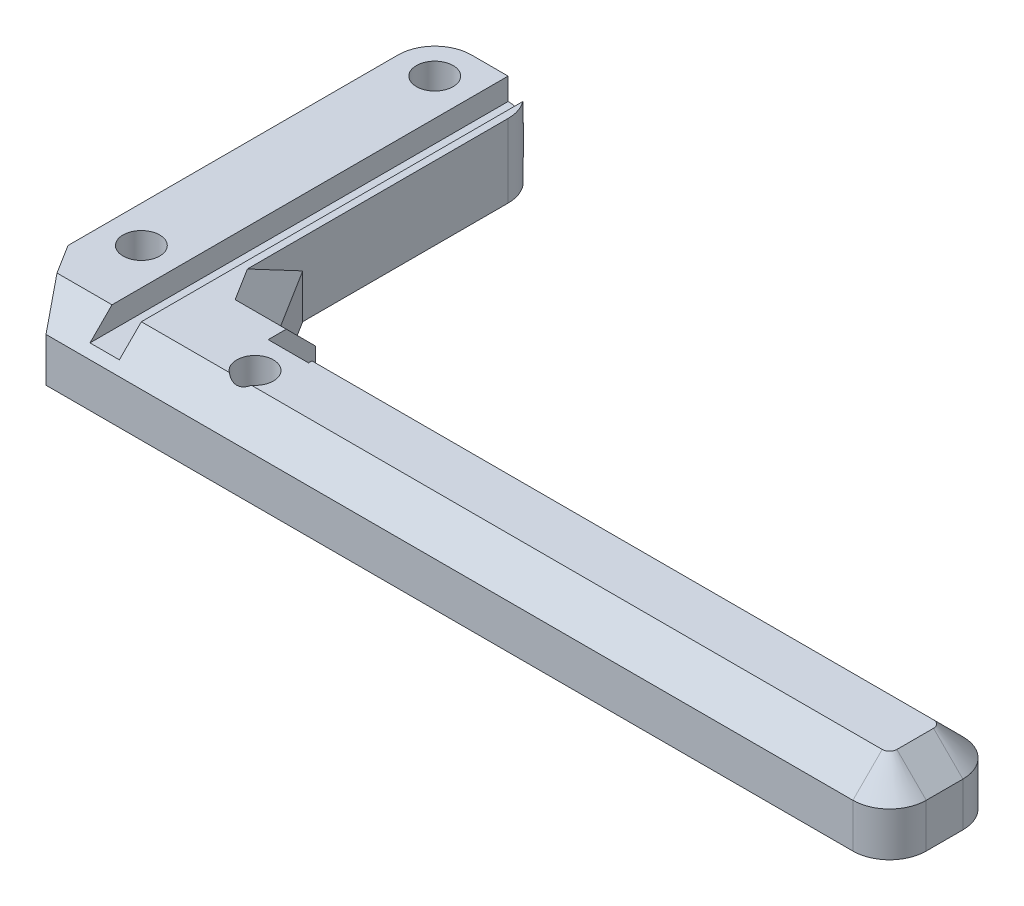
ISO-10303-21;
HEADER;
FILE_DESCRIPTION(('STEP AP214'),'2;1');
FILE_NAME('part.step','',(''),(''),'','','');
FILE_SCHEMA(('AUTOMOTIVE_DESIGN { 1 0 10303 214 1 1 1 1 }'));
ENDSEC;
DATA;
#1=APPLICATION_CONTEXT('core data for automotive mechanical design processes');
#2=APPLICATION_PROTOCOL_DEFINITION('international standard','automotive_design',2000,#1);
#3=PRODUCT_CONTEXT('',#1,'mechanical');
#4=PRODUCT('Part','Part','',(#3));
#5=PRODUCT_RELATED_PRODUCT_CATEGORY('part','',(#4));
#6=PRODUCT_DEFINITION_FORMATION('','',#4);
#7=PRODUCT_DEFINITION_CONTEXT('part definition',#1,'design');
#8=PRODUCT_DEFINITION('design','',#6,#7);
#9=PRODUCT_DEFINITION_SHAPE('','',#8);
#10=(LENGTH_UNIT() NAMED_UNIT(*) SI_UNIT(.MILLI.,.METRE.));
#11=(NAMED_UNIT(*) PLANE_ANGLE_UNIT() SI_UNIT($,.RADIAN.));
#12=(NAMED_UNIT(*) SI_UNIT($,.STERADIAN.) SOLID_ANGLE_UNIT());
#13=UNCERTAINTY_MEASURE_WITH_UNIT(LENGTH_MEASURE(1.E-05),#10,'distance_accuracy_value','');
#14=(GEOMETRIC_REPRESENTATION_CONTEXT(3) GLOBAL_UNCERTAINTY_ASSIGNED_CONTEXT((#13)) GLOBAL_UNIT_ASSIGNED_CONTEXT((#10,
#11,#12)) REPRESENTATION_CONTEXT('',''));
#15=CARTESIAN_POINT('',(0.,0.,0.));
#16=DIRECTION('',(0.,0.,1.));
#17=DIRECTION('',(1.,0.,0.));
#18=AXIS2_PLACEMENT_3D('',#15,#16,#17);
#19=CARTESIAN_POINT('',(0.,10.,0.));
#20=DIRECTION('',(0.,1.,0.));
#21=DIRECTION('',(0.,0.,1.));
#22=AXIS2_PLACEMENT_3D('',#19,#20,#21);
#23=PLANE('',#22);
#24=CARTESIAN_POINT('',(27.5,10.,27.));
#25=DIRECTION('',(0.,1.,0.));
#26=DIRECTION('',(0.,0.,1.));
#27=AXIS2_PLACEMENT_3D('',#24,#25,#26);
#28=CIRCLE('',#27,2.5);
#29=CARTESIAN_POINT('',(29.,10.,29.));
#30=VERTEX_POINT('',#29);
#31=CARTESIAN_POINT('',(26.,10.,29.));
#32=VERTEX_POINT('',#31);
#33=EDGE_CURVE('E61',#30,#32,#28,.T.);
#34=ORIENTED_EDGE('',*,*,#33,.F.);
#35=DIRECTION('',(1.,0.,0.));
#36=VECTOR('',#35,1.);
#37=CARTESIAN_POINT('',(115.,10.,29.));
#38=LINE('',#37,#36);
#39=CARTESIAN_POINT('',(115.,10.,29.));
#40=VERTEX_POINT('',#39);
#41=EDGE_CURVE('E217',#30,#40,#38,.T.);
#42=ORIENTED_EDGE('',*,*,#41,.T.);
#43=CARTESIAN_POINT('',(115.,10.,28.));
#44=DIRECTION('',(0.,1.,0.));
#45=DIRECTION('',(0.,0.,1.));
#46=AXIS2_PLACEMENT_3D('',#43,#44,#45);
#47=CIRCLE('',#46,0.999999999999987);
#48=CARTESIAN_POINT('',(116.,10.,28.));
#49=VERTEX_POINT('',#48);
#50=EDGE_CURVE('E230',#40,#49,#47,.T.);
#51=ORIENTED_EDGE('',*,*,#50,.T.);
#52=DIRECTION('',(0.,0.,-1.));
#53=VECTOR('',#52,1.);
#54=CARTESIAN_POINT('',(116.,10.,23.));
#55=LINE('',#54,#53);
#56=CARTESIAN_POINT('',(116.,10.,23.));
#57=VERTEX_POINT('',#56);
#58=EDGE_CURVE('E235',#49,#57,#55,.T.);
#59=ORIENTED_EDGE('',*,*,#58,.T.);
#60=CARTESIAN_POINT('',(115.,10.,23.));
#61=DIRECTION('',(0.,1.,0.));
#62=DIRECTION('',(0.,0.,1.));
#63=AXIS2_PLACEMENT_3D('',#60,#61,#62);
#64=CIRCLE('',#63,0.999999999999987);
#65=CARTESIAN_POINT('',(115.,10.,22.));
#66=VERTEX_POINT('',#65);
#67=EDGE_CURVE('E503',#57,#66,#64,.T.);
#68=ORIENTED_EDGE('',*,*,#67,.T.);
#69=DIRECTION('',(-1.,0.,0.));
#70=VECTOR('',#69,1.);
#71=CARTESIAN_POINT('',(30.26,10.,22.));
#72=LINE('',#71,#70);
#73=CARTESIAN_POINT('',(30.26,10.,22.));
#74=VERTEX_POINT('',#73);
#75=EDGE_CURVE('E500',#66,#74,#72,.T.);
#76=ORIENTED_EDGE('',*,*,#75,.T.);
#77=DIRECTION('',(0.,0.,1.));
#78=VECTOR('',#77,1.);
#79=CARTESIAN_POINT('',(30.26,10.,22.47));
#80=LINE('',#79,#78);
#81=CARTESIAN_POINT('',(30.26,10.,22.47));
#82=VERTEX_POINT('',#81);
#83=EDGE_CURVE('E354',#74,#82,#80,.T.);
#84=ORIENTED_EDGE('',*,*,#83,.T.);
#85=DIRECTION('',(-1.,0.,0.));
#86=VECTOR('',#85,1.);
#87=CARTESIAN_POINT('',(24.76,10.,22.47));
#88=LINE('',#87,#86);
#89=CARTESIAN_POINT('',(24.76,10.,22.47));
#90=VERTEX_POINT('',#89);
#91=EDGE_CURVE('E358',#82,#90,#88,.T.);
#92=ORIENTED_EDGE('',*,*,#91,.T.);
#93=DIRECTION('',(0.,0.,-1.));
#94=VECTOR('',#93,1.);
#95=CARTESIAN_POINT('',(24.76,10.,16.));
#96=LINE('',#95,#94);
#97=CARTESIAN_POINT('',(24.76,10.,20.));
#98=VERTEX_POINT('',#97);
#99=EDGE_CURVE('E361',#90,#98,#96,.T.);
#100=ORIENTED_EDGE('',*,*,#99,.T.);
#101=DIRECTION('',(-1.,0.,0.));
#102=VECTOR('',#101,1.);
#103=CARTESIAN_POINT('',(20.,10.,20.));
#104=LINE('',#103,#102);
#105=CARTESIAN_POINT('',(17.7830094339717,10.,20.));
#106=VERTEX_POINT('',#105);
#107=EDGE_CURVE('E291',#98,#106,#104,.T.);
#108=ORIENTED_EDGE('',*,*,#107,.T.);
#109=DIRECTION('',(-0.52999894000318,0.,-0.847998304005088));
#110=VECTOR('',#109,1.);
#111=CARTESIAN_POINT('',(11.6080067839797,10.,10.1199957600127));
#112=LINE('',#111,#110);
#113=CARTESIAN_POINT('',(15.,10.,15.5471849056453));
#114=VERTEX_POINT('',#113);
#115=EDGE_CURVE('E271',#106,#114,#112,.T.);
#116=ORIENTED_EDGE('',*,*,#115,.T.);
#117=DIRECTION('',(0.,0.,-1.));
#118=VECTOR('',#117,1.);
#119=CARTESIAN_POINT('',(15.,10.,-25.));
#120=LINE('',#119,#118);
#121=CARTESIAN_POINT('',(15.,10.,-20.));
#122=VERTEX_POINT('',#121);
#123=EDGE_CURVE('E365',#114,#122,#120,.T.);
#124=ORIENTED_EDGE('',*,*,#123,.T.);
#125=CARTESIAN_POINT('',(9.99999999999999,10.,-20.));
#126=DIRECTION('',(0.,1.,0.));
#127=DIRECTION('',(0.,0.,1.));
#128=AXIS2_PLACEMENT_3D('',#125,#126,#127);
#129=CIRCLE('',#128,5.);
#130=CARTESIAN_POINT('',(14.,10.,-23.));
#131=VERTEX_POINT('',#130);
#132=EDGE_CURVE('E469',#122,#131,#129,.T.);
#133=ORIENTED_EDGE('',*,*,#132,.T.);
#134=DIRECTION('',(0.,0.,-1.));
#135=VECTOR('',#134,1.);
#136=CARTESIAN_POINT('',(14.,10.,36.3210046905422));
#137=LINE('',#136,#135);
#138=CARTESIAN_POINT('',(14.,10.,29.));
#139=VERTEX_POINT('',#138);
#140=EDGE_CURVE('E322',#139,#131,#137,.T.);
#141=ORIENTED_EDGE('',*,*,#140,.F.);
#142=EDGE_CURVE('E220',#139,#32,#38,.T.);
#143=ORIENTED_EDGE('',*,*,#142,.T.);
#144=EDGE_LOOP('',(#34,#42,#51,#59,#68,#76,#84,#92,#100,#108,#116,#124,#133,#141,#143));
#145=FACE_BOUND('',#144,.T.);
#146=ADVANCED_FACE('F46',(#145),#23,.T.);
#147=DIRECTION('',(0.529998940003181,0.,0.847998304005088));
#148=VECTOR('',#147,1.);
#149=CARTESIAN_POINT('',(0.,10.,25.));
#150=LINE('',#149,#148);
#151=CARTESIAN_POINT('',(0.,10.,25.));
#152=VERTEX_POINT('',#151);
#153=CARTESIAN_POINT('',(2.49999999999999,10.,29.));
#154=VERTEX_POINT('',#153);
#155=EDGE_CURVE('E350',#152,#154,#150,.T.);
#156=ORIENTED_EDGE('',*,*,#155,.T.);
#157=DIRECTION('',(1.,0.,0.));
#158=VECTOR('',#157,1.);
#159=CARTESIAN_POINT('',(0.,10.,29.));
#160=LINE('',#159,#158);
#161=CARTESIAN_POINT('',(9.99999999999999,10.,29.));
#162=VERTEX_POINT('',#161);
#163=EDGE_CURVE('E244',#154,#162,#160,.T.);
#164=ORIENTED_EDGE('',*,*,#163,.T.);
#165=DIRECTION('',(0.,0.,1.));
#166=VECTOR('',#165,1.);
#167=CARTESIAN_POINT('',(9.99999999999999,10.,-25.));
#168=LINE('',#167,#166);
#169=CARTESIAN_POINT('',(9.99999999999999,10.,-25.));
#170=VERTEX_POINT('',#169);
#171=EDGE_CURVE('E287',#170,#162,#168,.T.);
#172=ORIENTED_EDGE('',*,*,#171,.F.);
#173=DIRECTION('',(-1.,0.,0.));
#174=VECTOR('',#173,1.);
#175=CARTESIAN_POINT('',(0.,10.,-25.));
#176=LINE('',#175,#174);
#177=CARTESIAN_POINT('',(4.99999999999999,10.,-25.));
#178=VERTEX_POINT('',#177);
#179=EDGE_CURVE('E369',#170,#178,#176,.T.);
#180=ORIENTED_EDGE('',*,*,#179,.T.);
#181=CARTESIAN_POINT('',(4.99999999999999,10.,-20.));
#182=DIRECTION('',(0.,1.,0.));
#183=DIRECTION('',(0.,0.,1.));
#184=AXIS2_PLACEMENT_3D('',#181,#182,#183);
#185=CIRCLE('',#184,5.);
#186=CARTESIAN_POINT('',(0.,10.,-20.));
#187=VERTEX_POINT('',#186);
#188=EDGE_CURVE('E487',#178,#187,#185,.T.);
#189=ORIENTED_EDGE('',*,*,#188,.T.);
#190=DIRECTION('',(0.,0.,1.));
#191=VECTOR('',#190,1.);
#192=CARTESIAN_POINT('',(0.,10.,25.));
#193=LINE('',#192,#191);
#194=EDGE_CURVE('E373',#187,#152,#193,.T.);
#195=ORIENTED_EDGE('',*,*,#194,.T.);
#196=EDGE_LOOP('',(#156,#164,#172,#180,#189,#195));
#197=FACE_BOUND('',#196,.T.);
#198=CARTESIAN_POINT('',(5.,10.,-20.));
#199=DIRECTION('',(0.,1.,0.));
#200=DIRECTION('',(0.,0.,1.));
#201=AXIS2_PLACEMENT_3D('',#198,#199,#200);
#202=CIRCLE('',#201,2.5);
#203=CARTESIAN_POINT('',(5.,10.,-17.5));
#204=VERTEX_POINT('',#203);
#205=EDGE_CURVE('E342',#204,#204,#202,.T.);
#206=ORIENTED_EDGE('',*,*,#205,.F.);
#207=EDGE_LOOP('',(#206));
#208=FACE_BOUND('',#207,.T.);
#209=CARTESIAN_POINT('',(5.00000000000001,10.,20.));
#210=DIRECTION('',(0.,1.,0.));
#211=DIRECTION('',(0.,0.,1.));
#212=AXIS2_PLACEMENT_3D('',#209,#210,#211);
#213=CIRCLE('',#212,2.5);
#214=CARTESIAN_POINT('',(5.00000000000001,10.,22.5));
#215=VERTEX_POINT('',#214);
#216=EDGE_CURVE('E334',#215,#215,#213,.T.);
#217=ORIENTED_EDGE('',*,*,#216,.F.);
#218=EDGE_LOOP('',(#217));
#219=FACE_BOUND('',#218,.T.);
#220=ADVANCED_FACE('F607',(#197,#208,#219),#23,.T.);
#221=CARTESIAN_POINT('',(0.,0.,0.));
#222=DIRECTION('',(0.,1.,0.));
#223=DIRECTION('',(0.,0.,1.));
#224=AXIS2_PLACEMENT_3D('',#221,#222,#223);
#225=PLANE('',#224);
#226=CARTESIAN_POINT('',(27.5,0.,27.));
#227=DIRECTION('',(0.,1.,0.));
#228=DIRECTION('',(0.,0.,1.));
#229=AXIS2_PLACEMENT_3D('',#226,#227,#228);
#230=CIRCLE('',#229,2.5);
#231=CARTESIAN_POINT('',(27.5,0.,29.5));
#232=VERTEX_POINT('',#231);
#233=EDGE_CURVE('E222',#232,#232,#230,.T.);
#234=ORIENTED_EDGE('',*,*,#233,.T.);
#235=EDGE_LOOP('',(#234));
#236=FACE_BOUND('',#235,.T.);
#237=DIRECTION('',(0.,0.,-1.));
#238=VECTOR('',#237,1.);
#239=CARTESIAN_POINT('',(120.,0.,33.));
#240=LINE('',#239,#238);
#241=CARTESIAN_POINT('',(120.,0.,28.));
#242=VERTEX_POINT('',#241);
#243=CARTESIAN_POINT('',(120.,0.,23.));
#244=VERTEX_POINT('',#243);
#245=EDGE_CURVE('E384',#242,#244,#240,.T.);
#246=ORIENTED_EDGE('',*,*,#245,.F.);
#247=CARTESIAN_POINT('',(115.,0.,28.));
#248=DIRECTION('',(0.,1.,0.));
#249=DIRECTION('',(0.,0.,1.));
#250=AXIS2_PLACEMENT_3D('',#247,#248,#249);
#251=CIRCLE('',#250,5.);
#252=CARTESIAN_POINT('',(115.,0.,33.));
#253=VERTEX_POINT('',#252);
#254=EDGE_CURVE('E462',#242,#253,#251,.F.);
#255=ORIENTED_EDGE('',*,*,#254,.T.);
#256=DIRECTION('',(1.,0.,0.));
#257=VECTOR('',#256,1.);
#258=CARTESIAN_POINT('',(5.00000000000001,0.,33.));
#259=LINE('',#258,#257);
#260=CARTESIAN_POINT('',(5.00000000000001,0.,33.));
#261=VERTEX_POINT('',#260);
#262=EDGE_CURVE('E380',#261,#253,#259,.T.);
#263=ORIENTED_EDGE('',*,*,#262,.F.);
#264=DIRECTION('',(0.529998940003181,0.,0.847998304005088));
#265=VECTOR('',#264,1.);
#266=CARTESIAN_POINT('',(0.,0.,25.));
#267=LINE('',#266,#265);
#268=CARTESIAN_POINT('',(0.,0.,25.));
#269=VERTEX_POINT('',#268);
#270=EDGE_CURVE('E346',#269,#261,#267,.T.);
#271=ORIENTED_EDGE('',*,*,#270,.F.);
#272=DIRECTION('',(0.,0.,1.));
#273=VECTOR('',#272,1.);
#274=CARTESIAN_POINT('',(0.,0.,25.));
#275=LINE('',#274,#273);
#276=CARTESIAN_POINT('',(0.,0.,-20.));
#277=VERTEX_POINT('',#276);
#278=EDGE_CURVE('E355',#277,#269,#275,.T.);
#279=ORIENTED_EDGE('',*,*,#278,.F.);
#280=CARTESIAN_POINT('',(4.99999999999999,0.,-20.));
#281=DIRECTION('',(0.,1.,0.));
#282=DIRECTION('',(0.,0.,1.));
#283=AXIS2_PLACEMENT_3D('',#280,#281,#282);
#284=CIRCLE('',#283,5.);
#285=CARTESIAN_POINT('',(4.99999999999999,0.,-25.));
#286=VERTEX_POINT('',#285);
#287=EDGE_CURVE('E456',#277,#286,#284,.F.);
#288=ORIENTED_EDGE('',*,*,#287,.T.);
#289=DIRECTION('',(-1.,0.,0.));
#290=VECTOR('',#289,1.);
#291=CARTESIAN_POINT('',(0.,0.,-25.));
#292=LINE('',#291,#290);
#293=CARTESIAN_POINT('',(9.99999999999999,0.,-25.));
#294=VERTEX_POINT('',#293);
#295=EDGE_CURVE('E414',#294,#286,#292,.T.);
#296=ORIENTED_EDGE('',*,*,#295,.F.);
#297=CARTESIAN_POINT('',(9.99999999999999,0.,-20.));
#298=DIRECTION('',(0.,1.,0.));
#299=DIRECTION('',(0.,0.,1.));
#300=AXIS2_PLACEMENT_3D('',#297,#298,#299);
#301=CIRCLE('',#300,5.);
#302=CARTESIAN_POINT('',(15.,0.,-20.));
#303=VERTEX_POINT('',#302);
#304=EDGE_CURVE('E453',#294,#303,#301,.F.);
#305=ORIENTED_EDGE('',*,*,#304,.T.);
#306=DIRECTION('',(0.,0.,-1.));
#307=VECTOR('',#306,1.);
#308=CARTESIAN_POINT('',(15.,0.,-25.));
#309=LINE('',#308,#307);
#310=CARTESIAN_POINT('',(15.,0.,8.00000000000001));
#311=VERTEX_POINT('',#310);
#312=EDGE_CURVE('E410',#311,#303,#309,.T.);
#313=ORIENTED_EDGE('',*,*,#312,.F.);
#314=DIRECTION('',(-0.52999894000318,0.,-0.847998304005088));
#315=VECTOR('',#314,1.);
#316=CARTESIAN_POINT('',(15.,0.,8.00000000000001));
#317=LINE('',#316,#315);
#318=CARTESIAN_POINT('',(20.,0.,16.));
#319=VERTEX_POINT('',#318);
#320=EDGE_CURVE('E406',#319,#311,#317,.T.);
#321=ORIENTED_EDGE('',*,*,#320,.F.);
#322=DIRECTION('',(-1.,0.,0.));
#323=VECTOR('',#322,1.);
#324=CARTESIAN_POINT('',(20.,0.,16.));
#325=LINE('',#324,#323);
#326=CARTESIAN_POINT('',(24.76,0.,16.));
#327=VERTEX_POINT('',#326);
#328=EDGE_CURVE('E402',#327,#319,#325,.T.);
#329=ORIENTED_EDGE('',*,*,#328,.F.);
#330=DIRECTION('',(0.,0.,-1.));
#331=VECTOR('',#330,1.);
#332=CARTESIAN_POINT('',(24.76,0.,16.));
#333=LINE('',#332,#331);
#334=CARTESIAN_POINT('',(24.76,0.,22.47));
#335=VERTEX_POINT('',#334);
#336=EDGE_CURVE('E398',#335,#327,#333,.T.);
#337=ORIENTED_EDGE('',*,*,#336,.F.);
#338=DIRECTION('',(-1.,0.,0.));
#339=VECTOR('',#338,1.);
#340=CARTESIAN_POINT('',(24.76,0.,22.47));
#341=LINE('',#340,#339);
#342=CARTESIAN_POINT('',(30.26,0.,22.47));
#343=VERTEX_POINT('',#342);
#344=EDGE_CURVE('E395',#343,#335,#341,.T.);
#345=ORIENTED_EDGE('',*,*,#344,.F.);
#346=DIRECTION('',(0.,0.,1.));
#347=VECTOR('',#346,1.);
#348=CARTESIAN_POINT('',(30.26,0.,22.47));
#349=LINE('',#348,#347);
#350=CARTESIAN_POINT('',(30.26,0.,18.));
#351=VERTEX_POINT('',#350);
#352=EDGE_CURVE('E392',#351,#343,#349,.T.);
#353=ORIENTED_EDGE('',*,*,#352,.F.);
#354=DIRECTION('',(-1.,0.,0.));
#355=VECTOR('',#354,1.);
#356=CARTESIAN_POINT('',(30.26,0.,18.));
#357=LINE('',#356,#355);
#358=CARTESIAN_POINT('',(115.,0.,18.));
#359=VERTEX_POINT('',#358);
#360=EDGE_CURVE('E388',#359,#351,#357,.T.);
#361=ORIENTED_EDGE('',*,*,#360,.F.);
#362=CARTESIAN_POINT('',(115.,0.,23.));
#363=DIRECTION('',(0.,1.,0.));
#364=DIRECTION('',(0.,0.,1.));
#365=AXIS2_PLACEMENT_3D('',#362,#363,#364);
#366=CIRCLE('',#365,5.);
#367=EDGE_CURVE('E459',#359,#244,#366,.F.);
#368=ORIENTED_EDGE('',*,*,#367,.T.);
#369=EDGE_LOOP('',(#246,#255,#263,#271,#279,#288,#296,#305,#313,#321,#329,#337,#345,#353,#361,#368));
#370=FACE_BOUND('',#369,.T.);
#371=CARTESIAN_POINT('',(5.,0.,-20.));
#372=DIRECTION('',(0.,1.,0.));
#373=DIRECTION('',(0.,0.,1.));
#374=AXIS2_PLACEMENT_3D('',#371,#372,#373);
#375=CIRCLE('',#374,2.5);
#376=CARTESIAN_POINT('',(5.,0.,-17.5));
#377=VERTEX_POINT('',#376);
#378=EDGE_CURVE('E338',#377,#377,#375,.T.);
#379=ORIENTED_EDGE('',*,*,#378,.T.);
#380=EDGE_LOOP('',(#379));
#381=FACE_BOUND('',#380,.T.);
#382=CARTESIAN_POINT('',(5.00000000000001,0.,20.));
#383=DIRECTION('',(0.,1.,0.));
#384=DIRECTION('',(0.,0.,1.));
#385=AXIS2_PLACEMENT_3D('',#382,#383,#384);
#386=CIRCLE('',#385,2.5);
#387=CARTESIAN_POINT('',(5.00000000000001,0.,22.5));
#388=VERTEX_POINT('',#387);
#389=EDGE_CURVE('E333',#388,#388,#386,.T.);
#390=ORIENTED_EDGE('',*,*,#389,.T.);
#391=EDGE_LOOP('',(#390));
#392=FACE_BOUND('',#391,.T.);
#393=ADVANCED_FACE('F530',(#236,#370,#381,#392),#225,.F.);
#394=CARTESIAN_POINT('',(0.,10.,25.));
#395=DIRECTION('',(0.847998304005088,0.,-0.529998940003181));
#396=DIRECTION('',(-0.529998940003181,0.,-0.847998304005088));
#397=AXIS2_PLACEMENT_3D('',#394,#395,#396);
#398=PLANE('',#397);
#399=DIRECTION('',(0.,-1.,0.));
#400=VECTOR('',#399,1.);
#401=CARTESIAN_POINT('',(5.00000000000001,10.,33.));
#402=LINE('',#401,#400);
#403=CARTESIAN_POINT('',(5.00000000000001,5.99999999999997,33.));
#404=VERTEX_POINT('',#403);
#405=EDGE_CURVE('E443',#404,#261,#402,.T.);
#406=ORIENTED_EDGE('',*,*,#405,.F.);
#407=DIRECTION('',(-0.404226041727222,0.646761666763556,-0.646761666763554));
#408=VECTOR('',#407,1.);
#409=CARTESIAN_POINT('',(2.09150326797385,10.6535947712418,28.3464052287582));
#410=LINE('',#409,#408);
#411=EDGE_CURVE('E241',#404,#154,#410,.T.);
#412=ORIENTED_EDGE('',*,*,#411,.T.);
#413=ORIENTED_EDGE('',*,*,#155,.F.);
#414=DIRECTION('',(0.,-1.,0.));
#415=VECTOR('',#414,1.);
#416=CARTESIAN_POINT('',(0.,10.,25.));
#417=LINE('',#416,#415);
#418=EDGE_CURVE('E376',#152,#269,#417,.T.);
#419=ORIENTED_EDGE('',*,*,#418,.T.);
#420=ORIENTED_EDGE('',*,*,#270,.T.);
#421=EDGE_LOOP('',(#406,#412,#413,#419,#420));
#422=FACE_BOUND('',#421,.T.);
#423=ADVANCED_FACE('F620',(#422),#398,.F.);
#424=CARTESIAN_POINT('',(5.00000000000001,10.,33.));
#425=DIRECTION('',(0.,0.,-1.));
#426=DIRECTION('',(-1.,0.,0.));
#427=AXIS2_PLACEMENT_3D('',#424,#425,#426);
#428=PLANE('',#427);
#429=DIRECTION('',(0.,-1.,0.));
#430=VECTOR('',#429,1.);
#431=CARTESIAN_POINT('',(115.,10.,33.));
#432=LINE('',#431,#430);
#433=CARTESIAN_POINT('',(115.,5.99999999999997,33.));
#434=VERTEX_POINT('',#433);
#435=EDGE_CURVE('E465',#253,#434,#432,.F.);
#436=ORIENTED_EDGE('',*,*,#435,.T.);
#437=DIRECTION('',(-1.,0.,0.));
#438=VECTOR('',#437,1.);
#439=CARTESIAN_POINT('',(14.,5.99999999999997,33.));
#440=LINE('',#439,#438);
#441=EDGE_CURVE('E234',#434,#404,#440,.T.);
#442=ORIENTED_EDGE('',*,*,#441,.T.);
#443=ORIENTED_EDGE('',*,*,#405,.T.);
#444=ORIENTED_EDGE('',*,*,#262,.T.);
#445=EDGE_LOOP('',(#436,#442,#443,#444));
#446=FACE_BOUND('',#445,.T.);
#447=ADVANCED_FACE('F644',(#446),#428,.F.);
#448=CARTESIAN_POINT('',(120.,10.,33.));
#449=DIRECTION('',(-1.,0.,0.));
#450=DIRECTION('',(0.,0.,1.));
#451=AXIS2_PLACEMENT_3D('',#448,#449,#450);
#452=PLANE('',#451);
#453=DIRECTION('',(0.,-1.,0.));
#454=VECTOR('',#453,1.);
#455=CARTESIAN_POINT('',(120.,10.,23.));
#456=LINE('',#455,#454);
#457=CARTESIAN_POINT('',(120.,5.99999999999997,23.));
#458=VERTEX_POINT('',#457);
#459=EDGE_CURVE('E446',#244,#458,#456,.F.);
#460=ORIENTED_EDGE('',*,*,#459,.T.);
#461=DIRECTION('',(0.,0.,1.));
#462=VECTOR('',#461,1.);
#463=CARTESIAN_POINT('',(120.,5.99999999999997,28.));
#464=LINE('',#463,#462);
#465=CARTESIAN_POINT('',(120.,5.99999999999997,28.));
#466=VERTEX_POINT('',#465);
#467=EDGE_CURVE('E259',#458,#466,#464,.T.);
#468=ORIENTED_EDGE('',*,*,#467,.T.);
#469=DIRECTION('',(0.,-1.,0.));
#470=VECTOR('',#469,1.);
#471=CARTESIAN_POINT('',(120.,10.,28.));
#472=LINE('',#471,#470);
#473=EDGE_CURVE('E450',#466,#242,#472,.T.);
#474=ORIENTED_EDGE('',*,*,#473,.T.);
#475=ORIENTED_EDGE('',*,*,#245,.T.);
#476=EDGE_LOOP('',(#460,#468,#474,#475));
#477=FACE_BOUND('',#476,.T.);
#478=ADVANCED_FACE('F521',(#477),#452,.F.);
#479=CARTESIAN_POINT('',(30.26,10.,18.));
#480=DIRECTION('',(0.,0.,1.));
#481=DIRECTION('',(1.,0.,0.));
#482=AXIS2_PLACEMENT_3D('',#479,#480,#481);
#483=PLANE('',#482);
#484=DIRECTION('',(0.,-1.,0.));
#485=VECTOR('',#484,1.);
#486=CARTESIAN_POINT('',(30.26,10.,18.));
#487=LINE('',#486,#485);
#488=CARTESIAN_POINT('',(30.26,5.99999999999997,18.));
#489=VERTEX_POINT('',#488);
#490=EDGE_CURVE('E440',#489,#351,#487,.T.);
#491=ORIENTED_EDGE('',*,*,#490,.F.);
#492=DIRECTION('',(1.,0.,0.));
#493=VECTOR('',#492,1.);
#494=CARTESIAN_POINT('',(115.,5.99999999999997,18.));
#495=LINE('',#494,#493);
#496=CARTESIAN_POINT('',(115.,5.99999999999997,18.));
#497=VERTEX_POINT('',#496);
#498=EDGE_CURVE('E268',#489,#497,#495,.T.);
#499=ORIENTED_EDGE('',*,*,#498,.T.);
#500=DIRECTION('',(0.,-1.,0.));
#501=VECTOR('',#500,1.);
#502=CARTESIAN_POINT('',(115.,10.,18.));
#503=LINE('',#502,#501);
#504=EDGE_CURVE('E473',#497,#359,#503,.T.);
#505=ORIENTED_EDGE('',*,*,#504,.T.);
#506=ORIENTED_EDGE('',*,*,#360,.T.);
#507=EDGE_LOOP('',(#491,#499,#505,#506));
#508=FACE_BOUND('',#507,.T.);
#509=ADVANCED_FACE('F651',(#508),#483,.F.);
#510=CARTESIAN_POINT('',(30.26,10.,22.47));
#511=DIRECTION('',(1.,0.,0.));
#512=DIRECTION('',(0.,0.,-1.));
#513=AXIS2_PLACEMENT_3D('',#510,#511,#512);
#514=PLANE('',#513);
#515=ORIENTED_EDGE('',*,*,#83,.F.);
#516=DIRECTION('',(0.,-0.707106781186549,-0.707106781186546));
#517=VECTOR('',#516,1.);
#518=CARTESIAN_POINT('',(30.26,10.,22.));
#519=LINE('',#518,#517);
#520=EDGE_CURVE('E265',#74,#489,#519,.T.);
#521=ORIENTED_EDGE('',*,*,#520,.T.);
#522=ORIENTED_EDGE('',*,*,#490,.T.);
#523=ORIENTED_EDGE('',*,*,#352,.T.);
#524=DIRECTION('',(0.,-1.,0.));
#525=VECTOR('',#524,1.);
#526=CARTESIAN_POINT('',(30.26,10.,22.47));
#527=LINE('',#526,#525);
#528=EDGE_CURVE('E436',#82,#343,#527,.T.);
#529=ORIENTED_EDGE('',*,*,#528,.F.);
#530=EDGE_LOOP('',(#515,#521,#522,#523,#529));
#531=FACE_BOUND('',#530,.T.);
#532=ADVANCED_FACE('F545',(#531),#514,.F.);
#533=CARTESIAN_POINT('',(24.76,10.,22.47));
#534=DIRECTION('',(0.,0.,1.));
#535=DIRECTION('',(1.,0.,0.));
#536=AXIS2_PLACEMENT_3D('',#533,#534,#535);
#537=PLANE('',#536);
#538=ORIENTED_EDGE('',*,*,#344,.T.);
#539=DIRECTION('',(0.,-1.,0.));
#540=VECTOR('',#539,1.);
#541=CARTESIAN_POINT('',(24.76,10.,22.47));
#542=LINE('',#541,#540);
#543=EDGE_CURVE('E432',#90,#335,#542,.T.);
#544=ORIENTED_EDGE('',*,*,#543,.F.);
#545=ORIENTED_EDGE('',*,*,#91,.F.);
#546=ORIENTED_EDGE('',*,*,#528,.T.);
#547=EDGE_LOOP('',(#538,#544,#545,#546));
#548=FACE_BOUND('',#547,.T.);
#549=ADVANCED_FACE('F552',(#548),#537,.F.);
#550=CARTESIAN_POINT('',(24.76,10.,16.));
#551=DIRECTION('',(-1.,0.,0.));
#552=DIRECTION('',(0.,0.,1.));
#553=AXIS2_PLACEMENT_3D('',#550,#551,#552);
#554=PLANE('',#553);
#555=DIRECTION('',(0.,-1.,0.));
#556=VECTOR('',#555,1.);
#557=CARTESIAN_POINT('',(24.76,10.,16.));
#558=LINE('',#557,#556);
#559=CARTESIAN_POINT('',(24.76,6.00000000000001,16.));
#560=VERTEX_POINT('',#559);
#561=EDGE_CURVE('E429',#560,#327,#558,.T.);
#562=ORIENTED_EDGE('',*,*,#561,.F.);
#563=DIRECTION('',(0.,0.707106781186548,0.707106781186547));
#564=VECTOR('',#563,1.);
#565=CARTESIAN_POINT('',(24.76,10.,20.));
#566=LINE('',#565,#564);
#567=EDGE_CURVE('E298',#560,#98,#566,.T.);
#568=ORIENTED_EDGE('',*,*,#567,.T.);
#569=ORIENTED_EDGE('',*,*,#99,.F.);
#570=ORIENTED_EDGE('',*,*,#543,.T.);
#571=ORIENTED_EDGE('',*,*,#336,.T.);
#572=EDGE_LOOP('',(#562,#568,#569,#570,#571));
#573=FACE_BOUND('',#572,.T.);
#574=ADVANCED_FACE('F558',(#573),#554,.F.);
#575=CARTESIAN_POINT('',(20.,10.,16.));
#576=DIRECTION('',(0.,0.,1.));
#577=DIRECTION('',(1.,0.,0.));
#578=AXIS2_PLACEMENT_3D('',#575,#576,#577);
#579=PLANE('',#578);
#580=DIRECTION('',(0.,-1.,0.));
#581=VECTOR('',#580,1.);
#582=CARTESIAN_POINT('',(20.,10.,16.));
#583=LINE('',#582,#581);
#584=CARTESIAN_POINT('',(20.,6.00000000000001,16.));
#585=VERTEX_POINT('',#584);
#586=EDGE_CURVE('E426',#585,#319,#583,.T.);
#587=ORIENTED_EDGE('',*,*,#586,.F.);
#588=DIRECTION('',(1.,0.,0.));
#589=VECTOR('',#588,1.);
#590=CARTESIAN_POINT('',(24.76,6.00000000000001,16.));
#591=LINE('',#590,#589);
#592=EDGE_CURVE('E295',#585,#560,#591,.T.);
#593=ORIENTED_EDGE('',*,*,#592,.T.);
#594=ORIENTED_EDGE('',*,*,#561,.T.);
#595=ORIENTED_EDGE('',*,*,#328,.T.);
#596=EDGE_LOOP('',(#587,#593,#594,#595));
#597=FACE_BOUND('',#596,.T.);
#598=ADVANCED_FACE('F563',(#597),#579,.F.);
#599=CARTESIAN_POINT('',(15.,10.,8.00000000000001));
#600=DIRECTION('',(-0.847998304005088,0.,0.52999894000318));
#601=DIRECTION('',(0.52999894000318,0.,0.847998304005088));
#602=AXIS2_PLACEMENT_3D('',#599,#600,#601);
#603=PLANE('',#602);
#604=DIRECTION('',(0.,-1.,0.));
#605=VECTOR('',#604,1.);
#606=CARTESIAN_POINT('',(15.,10.,8.00000000000001));
#607=LINE('',#606,#605);
#608=CARTESIAN_POINT('',(15.,6.00000000000001,8.00000000000001));
#609=VERTEX_POINT('',#608);
#610=EDGE_CURVE('E423',#609,#311,#607,.T.);
#611=ORIENTED_EDGE('',*,*,#610,.F.);
#612=DIRECTION('',(0.52999894000318,0.,0.847998304005088));
#613=VECTOR('',#612,1.);
#614=CARTESIAN_POINT('',(20.,6.00000000000001,16.));
#615=LINE('',#614,#613);
#616=EDGE_CURVE('E301',#609,#585,#615,.T.);
#617=ORIENTED_EDGE('',*,*,#616,.T.);
#618=ORIENTED_EDGE('',*,*,#586,.T.);
#619=ORIENTED_EDGE('',*,*,#320,.T.);
#620=EDGE_LOOP('',(#611,#617,#618,#619));
#621=FACE_BOUND('',#620,.T.);
#622=ADVANCED_FACE('F566',(#621),#603,.F.);
#623=CARTESIAN_POINT('',(15.,10.,-25.));
#624=DIRECTION('',(-1.,0.,0.));
#625=DIRECTION('',(0.,0.,1.));
#626=AXIS2_PLACEMENT_3D('',#623,#624,#625);
#627=PLANE('',#626);
#628=ORIENTED_EDGE('',*,*,#312,.T.);
#629=DIRECTION('',(0.,-1.,0.));
#630=VECTOR('',#629,1.);
#631=CARTESIAN_POINT('',(15.,10.,-20.));
#632=LINE('',#631,#630);
#633=EDGE_CURVE('E490',#303,#122,#632,.F.);
#634=ORIENTED_EDGE('',*,*,#633,.T.);
#635=ORIENTED_EDGE('',*,*,#123,.F.);
#636=DIRECTION('',(0.,-0.468292905790848,-0.883573287501362));
#637=VECTOR('',#636,1.);
#638=CARTESIAN_POINT('',(15.,-6.77725339288896,-16.1080734856041));
#639=LINE('',#638,#637);
#640=EDGE_CURVE('E56',#114,#609,#639,.T.);
#641=ORIENTED_EDGE('',*,*,#640,.T.);
#642=ORIENTED_EDGE('',*,*,#610,.T.);
#643=EDGE_LOOP('',(#628,#634,#635,#641,#642));
#644=FACE_BOUND('',#643,.T.);
#645=ADVANCED_FACE('F595',(#644),#627,.F.);
#646=CARTESIAN_POINT('',(0.,10.,-25.));
#647=DIRECTION('',(0.,0.,1.));
#648=DIRECTION('',(1.,0.,0.));
#649=AXIS2_PLACEMENT_3D('',#646,#647,#648);
#650=PLANE('',#649);
#651=ORIENTED_EDGE('',*,*,#295,.T.);
#652=DIRECTION('',(0.,-1.,0.));
#653=VECTOR('',#652,1.);
#654=CARTESIAN_POINT('',(4.99999999999999,10.,-25.));
#655=LINE('',#654,#653);
#656=EDGE_CURVE('E484',#286,#178,#655,.F.);
#657=ORIENTED_EDGE('',*,*,#656,.T.);
#658=ORIENTED_EDGE('',*,*,#179,.F.);
#659=DIRECTION('',(0.,1.,0.));
#660=VECTOR('',#659,1.);
#661=CARTESIAN_POINT('',(9.99999999999999,7.,-25.));
#662=LINE('',#661,#660);
#663=CARTESIAN_POINT('',(9.99999999999999,7.,-25.));
#664=VERTEX_POINT('',#663);
#665=EDGE_CURVE('E325',#664,#170,#662,.T.);
#666=ORIENTED_EDGE('',*,*,#665,.F.);
#667=DIRECTION('',(0.,-1.,0.));
#668=VECTOR('',#667,1.);
#669=CARTESIAN_POINT('',(9.99999999999999,10.,-25.));
#670=LINE('',#669,#668);
#671=EDGE_CURVE('E480',#664,#294,#670,.T.);
#672=ORIENTED_EDGE('',*,*,#671,.T.);
#673=EDGE_LOOP('',(#651,#657,#658,#666,#672));
#674=FACE_BOUND('',#673,.T.);
#675=ADVANCED_FACE('F593',(#674),#650,.F.);
#676=CARTESIAN_POINT('',(0.,10.,25.));
#677=DIRECTION('',(1.,0.,0.));
#678=DIRECTION('',(0.,0.,-1.));
#679=AXIS2_PLACEMENT_3D('',#676,#677,#678);
#680=PLANE('',#679);
#681=ORIENTED_EDGE('',*,*,#194,.F.);
#682=DIRECTION('',(0.,-1.,0.));
#683=VECTOR('',#682,1.);
#684=CARTESIAN_POINT('',(0.,10.,-20.));
#685=LINE('',#684,#683);
#686=EDGE_CURVE('E476',#187,#277,#685,.T.);
#687=ORIENTED_EDGE('',*,*,#686,.T.);
#688=ORIENTED_EDGE('',*,*,#278,.T.);
#689=ORIENTED_EDGE('',*,*,#418,.F.);
#690=EDGE_LOOP('',(#681,#687,#688,#689));
#691=FACE_BOUND('',#690,.T.);
#692=ADVANCED_FACE('F603',(#691),#680,.F.);
#693=CARTESIAN_POINT('',(5.,10.,-20.));
#694=DIRECTION('',(0.,-1.,0.));
#695=DIRECTION('',(0.,0.,-1.));
#696=AXIS2_PLACEMENT_3D('',#693,#694,#695);
#697=CYLINDRICAL_SURFACE('',#696,2.5);
#698=ORIENTED_EDGE('',*,*,#205,.T.);
#699=EDGE_LOOP('',(#698));
#700=FACE_BOUND('',#699,.T.);
#701=ORIENTED_EDGE('',*,*,#378,.F.);
#702=EDGE_LOOP('',(#701));
#703=FACE_BOUND('',#702,.T.);
#704=ADVANCED_FACE('F617',(#700,#703),#697,.F.);
#705=CARTESIAN_POINT('',(5.00000000000001,10.,20.));
#706=DIRECTION('',(0.,-1.,0.));
#707=DIRECTION('',(0.,0.,-1.));
#708=AXIS2_PLACEMENT_3D('',#705,#706,#707);
#709=CYLINDRICAL_SURFACE('',#708,2.5);
#710=ORIENTED_EDGE('',*,*,#216,.T.);
#711=EDGE_LOOP('',(#710));
#712=FACE_BOUND('',#711,.T.);
#713=ORIENTED_EDGE('',*,*,#389,.F.);
#714=EDGE_LOOP('',(#713));
#715=FACE_BOUND('',#714,.T.);
#716=ADVANCED_FACE('F627',(#712,#715),#709,.F.);
#717=CARTESIAN_POINT('',(14.,7.,36.3210046905422));
#718=DIRECTION('',(1.,0.,0.));
#719=DIRECTION('',(0.,0.,-1.));
#720=AXIS2_PLACEMENT_3D('',#717,#718,#719);
#721=PLANE('',#720);
#722=DIRECTION('',(0.,0.,-1.));
#723=VECTOR('',#722,1.);
#724=CARTESIAN_POINT('',(14.,7.,36.3210046905422));
#725=LINE('',#724,#723);
#726=CARTESIAN_POINT('',(14.,7.,32.));
#727=VERTEX_POINT('',#726);
#728=CARTESIAN_POINT('',(14.,7.,-23.));
#729=VERTEX_POINT('',#728);
#730=EDGE_CURVE('E321',#727,#729,#725,.T.);
#731=ORIENTED_EDGE('',*,*,#730,.F.);
#732=DIRECTION('',(0.,0.707106781186549,-0.707106781186546));
#733=VECTOR('',#732,1.);
#734=CARTESIAN_POINT('',(14.,10.,29.));
#735=LINE('',#734,#733);
#736=EDGE_CURVE('E253',#727,#139,#735,.T.);
#737=ORIENTED_EDGE('',*,*,#736,.T.);
#738=ORIENTED_EDGE('',*,*,#140,.T.);
#739=DIRECTION('',(0.,-1.,0.));
#740=VECTOR('',#739,1.);
#741=CARTESIAN_POINT('',(14.,10.,-23.));
#742=LINE('',#741,#740);
#743=EDGE_CURVE('E493',#131,#729,#742,.T.);
#744=ORIENTED_EDGE('',*,*,#743,.T.);
#745=EDGE_LOOP('',(#731,#737,#738,#744));
#746=FACE_BOUND('',#745,.T.);
#747=ADVANCED_FACE('F579',(#746),#721,.F.);
#748=CARTESIAN_POINT('',(9.99999999999999,7.,-25.));
#749=DIRECTION('',(-1.,0.,0.));
#750=DIRECTION('',(0.,0.,1.));
#751=AXIS2_PLACEMENT_3D('',#748,#749,#750);
#752=PLANE('',#751);
#753=ORIENTED_EDGE('',*,*,#171,.T.);
#754=DIRECTION('',(0.,-0.707106781186549,0.707106781186546));
#755=VECTOR('',#754,1.);
#756=CARTESIAN_POINT('',(9.99999999999999,10.,29.));
#757=LINE('',#756,#755);
#758=CARTESIAN_POINT('',(9.99999999999999,7.,32.));
#759=VERTEX_POINT('',#758);
#760=EDGE_CURVE('E247',#162,#759,#757,.T.);
#761=ORIENTED_EDGE('',*,*,#760,.T.);
#762=DIRECTION('',(0.,0.,1.));
#763=VECTOR('',#762,1.);
#764=CARTESIAN_POINT('',(9.99999999999999,7.,-25.));
#765=LINE('',#764,#763);
#766=EDGE_CURVE('E317',#664,#759,#765,.T.);
#767=ORIENTED_EDGE('',*,*,#766,.F.);
#768=ORIENTED_EDGE('',*,*,#665,.T.);
#769=EDGE_LOOP('',(#753,#761,#767,#768));
#770=FACE_BOUND('',#769,.T.);
#771=ADVANCED_FACE('F589',(#770),#752,.F.);
#772=CARTESIAN_POINT('',(0.,7.,0.));
#773=DIRECTION('',(0.,1.,0.));
#774=DIRECTION('',(0.,0.,1.));
#775=AXIS2_PLACEMENT_3D('',#772,#773,#774);
#776=PLANE('',#775);
#777=ORIENTED_EDGE('',*,*,#766,.T.);
#778=DIRECTION('',(1.,0.,0.));
#779=VECTOR('',#778,1.);
#780=CARTESIAN_POINT('',(0.,7.,32.));
#781=LINE('',#780,#779);
#782=EDGE_CURVE('E250',#759,#727,#781,.T.);
#783=ORIENTED_EDGE('',*,*,#782,.T.);
#784=ORIENTED_EDGE('',*,*,#730,.T.);
#785=CARTESIAN_POINT('',(9.99999999999999,7.,-20.));
#786=DIRECTION('',(0.,1.,0.));
#787=DIRECTION('',(0.,0.,1.));
#788=AXIS2_PLACEMENT_3D('',#785,#786,#787);
#789=CIRCLE('',#788,5.);
#790=EDGE_CURVE('E497',#729,#664,#789,.T.);
#791=ORIENTED_EDGE('',*,*,#790,.T.);
#792=EDGE_LOOP('',(#777,#783,#784,#791));
#793=FACE_BOUND('',#792,.T.);
#794=ADVANCED_FACE('F585',(#793),#776,.T.);
#795=CARTESIAN_POINT('',(115.,10.,28.));
#796=DIRECTION('',(0.,-1.,0.));
#797=DIRECTION('',(0.,0.,-1.));
#798=AXIS2_PLACEMENT_3D('',#795,#796,#797);
#799=CYLINDRICAL_SURFACE('',#798,5.);
#800=ORIENTED_EDGE('',*,*,#473,.F.);
#801=CARTESIAN_POINT('',(115.,5.99999999999997,28.));
#802=DIRECTION('',(0.,1.,0.));
#803=DIRECTION('',(0.,0.,1.));
#804=AXIS2_PLACEMENT_3D('',#801,#802,#803);
#805=CIRCLE('',#804,5.);
#806=EDGE_CURVE('E256',#466,#434,#805,.F.);
#807=ORIENTED_EDGE('',*,*,#806,.T.);
#808=ORIENTED_EDGE('',*,*,#435,.F.);
#809=ORIENTED_EDGE('',*,*,#254,.F.);
#810=EDGE_LOOP('',(#800,#807,#808,#809));
#811=FACE_BOUND('',#810,.T.);
#812=ADVANCED_FACE('F525',(#811),#799,.T.);
#813=CARTESIAN_POINT('',(115.,10.,23.));
#814=DIRECTION('',(0.,-1.,0.));
#815=DIRECTION('',(0.,0.,-1.));
#816=AXIS2_PLACEMENT_3D('',#813,#814,#815);
#817=CYLINDRICAL_SURFACE('',#816,5.);
#818=ORIENTED_EDGE('',*,*,#504,.F.);
#819=CARTESIAN_POINT('',(115.,5.99999999999997,23.));
#820=DIRECTION('',(0.,1.,0.));
#821=DIRECTION('',(0.,0.,1.));
#822=AXIS2_PLACEMENT_3D('',#819,#820,#821);
#823=CIRCLE('',#822,5.);
#824=EDGE_CURVE('E262',#497,#458,#823,.F.);
#825=ORIENTED_EDGE('',*,*,#824,.T.);
#826=ORIENTED_EDGE('',*,*,#459,.F.);
#827=ORIENTED_EDGE('',*,*,#367,.F.);
#828=EDGE_LOOP('',(#818,#825,#826,#827));
#829=FACE_BOUND('',#828,.T.);
#830=ADVANCED_FACE('F536',(#829),#817,.T.);
#831=CARTESIAN_POINT('',(4.99999999999999,10.,-20.));
#832=DIRECTION('',(0.,-1.,0.));
#833=DIRECTION('',(0.,0.,-1.));
#834=AXIS2_PLACEMENT_3D('',#831,#832,#833);
#835=CYLINDRICAL_SURFACE('',#834,5.);
#836=ORIENTED_EDGE('',*,*,#188,.F.);
#837=ORIENTED_EDGE('',*,*,#656,.F.);
#838=ORIENTED_EDGE('',*,*,#287,.F.);
#839=ORIENTED_EDGE('',*,*,#686,.F.);
#840=EDGE_LOOP('',(#836,#837,#838,#839));
#841=FACE_BOUND('',#840,.T.);
#842=ADVANCED_FACE('F636',(#841),#835,.T.);
#843=CARTESIAN_POINT('',(9.99999999999999,10.,-20.));
#844=DIRECTION('',(0.,-1.,0.));
#845=DIRECTION('',(0.,0.,-1.));
#846=AXIS2_PLACEMENT_3D('',#843,#844,#845);
#847=CYLINDRICAL_SURFACE('',#846,5.);
#848=ORIENTED_EDGE('',*,*,#132,.F.);
#849=ORIENTED_EDGE('',*,*,#633,.F.);
#850=ORIENTED_EDGE('',*,*,#304,.F.);
#851=ORIENTED_EDGE('',*,*,#671,.F.);
#852=ORIENTED_EDGE('',*,*,#790,.F.);
#853=ORIENTED_EDGE('',*,*,#743,.F.);
#854=EDGE_LOOP('',(#848,#849,#850,#851,#852,#853));
#855=FACE_BOUND('',#854,.T.);
#856=ADVANCED_FACE('F574',(#855),#847,.T.);
#857=CARTESIAN_POINT('',(0.,10.,22.0000000000001));
#858=DIRECTION('',(0.,0.707106781186546,-0.707106781186549));
#859=DIRECTION('',(1.,0.,0.));
#860=AXIS2_PLACEMENT_3D('',#857,#858,#859);
#861=PLANE('',#860);
#862=ORIENTED_EDGE('',*,*,#520,.F.);
#863=ORIENTED_EDGE('',*,*,#75,.F.);
#864=DIRECTION('',(0.,0.707106781186549,0.707106781186546));
#865=VECTOR('',#864,1.);
#866=CARTESIAN_POINT('',(115.,5.99999999999997,18.));
#867=LINE('',#866,#865);
#868=EDGE_CURVE('E283',#497,#66,#867,.T.);
#869=ORIENTED_EDGE('',*,*,#868,.F.);
#870=ORIENTED_EDGE('',*,*,#498,.F.);
#871=EDGE_LOOP('',(#862,#863,#869,#870));
#872=FACE_BOUND('',#871,.T.);
#873=ADVANCED_FACE('F541',(#872),#861,.T.);
#874=CARTESIAN_POINT('',(115.,10.,23.));
#875=DIRECTION('',(0.,-1.,0.));
#876=DIRECTION('',(0.,0.,-1.));
#877=AXIS2_PLACEMENT_3D('',#874,#875,#876);
#878=CONICAL_SURFACE('',#877,0.999999999999987,0.785398163397446);
#879=ORIENTED_EDGE('',*,*,#868,.T.);
#880=ORIENTED_EDGE('',*,*,#67,.F.);
#881=DIRECTION('',(-0.707106781186546,0.707106781186549,0.));
#882=VECTOR('',#881,1.);
#883=CARTESIAN_POINT('',(120.,5.99999999999997,23.));
#884=LINE('',#883,#882);
#885=EDGE_CURVE('E279',#458,#57,#884,.T.);
#886=ORIENTED_EDGE('',*,*,#885,.F.);
#887=ORIENTED_EDGE('',*,*,#824,.F.);
#888=EDGE_LOOP('',(#879,#880,#886,#887));
#889=FACE_BOUND('',#888,.T.);
#890=ADVANCED_FACE('F513',(#889),#878,.T.);
#891=CARTESIAN_POINT('',(116.,10.,0.));
#892=DIRECTION('',(0.707106781186549,0.707106781186546,0.));
#893=DIRECTION('',(0.,0.,1.));
#894=AXIS2_PLACEMENT_3D('',#891,#892,#893);
#895=PLANE('',#894);
#896=ORIENTED_EDGE('',*,*,#885,.T.);
#897=ORIENTED_EDGE('',*,*,#58,.F.);
#898=DIRECTION('',(-0.707106781186546,0.707106781186549,0.));
#899=VECTOR('',#898,1.);
#900=CARTESIAN_POINT('',(120.,5.99999999999997,28.));
#901=LINE('',#900,#899);
#902=EDGE_CURVE('E274',#466,#49,#901,.T.);
#903=ORIENTED_EDGE('',*,*,#902,.F.);
#904=ORIENTED_EDGE('',*,*,#467,.F.);
#905=EDGE_LOOP('',(#896,#897,#903,#904));
#906=FACE_BOUND('',#905,.T.);
#907=ADVANCED_FACE('F517',(#906),#895,.T.);
#908=CARTESIAN_POINT('',(115.,10.,28.));
#909=DIRECTION('',(0.,-1.,0.));
#910=DIRECTION('',(0.,0.,-1.));
#911=AXIS2_PLACEMENT_3D('',#908,#909,#910);
#912=CONICAL_SURFACE('',#911,0.999999999999984,0.785398163397447);
#913=ORIENTED_EDGE('',*,*,#902,.T.);
#914=ORIENTED_EDGE('',*,*,#50,.F.);
#915=DIRECTION('',(0.,0.707106781186549,-0.707106781186546));
#916=VECTOR('',#915,1.);
#917=CARTESIAN_POINT('',(115.,5.99999999999997,33.));
#918=LINE('',#917,#916);
#919=EDGE_CURVE('E227',#434,#40,#918,.T.);
#920=ORIENTED_EDGE('',*,*,#919,.F.);
#921=ORIENTED_EDGE('',*,*,#806,.F.);
#922=EDGE_LOOP('',(#913,#914,#920,#921));
#923=FACE_BOUND('',#922,.T.);
#924=ADVANCED_FACE('F669',(#923),#912,.T.);
#925=CARTESIAN_POINT('',(0.,10.,29.));
#926=DIRECTION('',(0.,0.707106781186546,0.707106781186549));
#927=DIRECTION('',(-1.,0.,0.));
#928=AXIS2_PLACEMENT_3D('',#925,#926,#927);
#929=PLANE('',#928);
#930=CARTESIAN_POINT('',(27.5,12.,27.));
#931=DIRECTION('',(0.,0.707106781186546,0.707106781186549));
#932=DIRECTION('',(0.,0.707106781186549,-0.707106781186546));
#933=AXIS2_PLACEMENT_3D('',#930,#931,#932);
#934=ELLIPSE('',#933,3.53553390593274,2.5);
#935=EDGE_CURVE('E11',#32,#30,#934,.T.);
#936=ORIENTED_EDGE('',*,*,#935,.F.);
#937=ORIENTED_EDGE('',*,*,#142,.F.);
#938=ORIENTED_EDGE('',*,*,#736,.F.);
#939=ORIENTED_EDGE('',*,*,#782,.F.);
#940=ORIENTED_EDGE('',*,*,#760,.F.);
#941=ORIENTED_EDGE('',*,*,#163,.F.);
#942=ORIENTED_EDGE('',*,*,#411,.F.);
#943=ORIENTED_EDGE('',*,*,#441,.F.);
#944=ORIENTED_EDGE('',*,*,#919,.T.);
#945=ORIENTED_EDGE('',*,*,#41,.F.);
#946=EDGE_LOOP('',(#936,#937,#938,#939,#940,#941,#942,#943,#944,#945));
#947=FACE_BOUND('',#946,.T.);
#948=ADVANCED_FACE('F224',(#947),#929,.T.);
#949=CARTESIAN_POINT('',(3.79901801993471,10.,-2.37438626245919));
#950=DIRECTION('',(0.59962535119669,0.707106781186547,-0.374765844497931));
#951=DIRECTION('',(0.52999894000318,0.,0.847998304005088));
#952=AXIS2_PLACEMENT_3D('',#949,#950,#951);
#953=PLANE('',#952);
#954=ORIENTED_EDGE('',*,*,#640,.F.);
#955=ORIENTED_EDGE('',*,*,#115,.F.);
#956=DIRECTION('',(0.364890142623925,-0.658352179238397,-0.658352179238396));
#957=VECTOR('',#956,1.);
#958=CARTESIAN_POINT('',(15.4152939116853,14.271945146845,24.271945146845));
#959=LINE('',#958,#957);
#960=EDGE_CURVE('E275',#585,#106,#959,.F.);
#961=ORIENTED_EDGE('',*,*,#960,.F.);
#962=ORIENTED_EDGE('',*,*,#616,.F.);
#963=EDGE_LOOP('',(#954,#955,#961,#962));
#964=FACE_BOUND('',#963,.T.);
#965=ADVANCED_FACE('F49',(#964),#953,.T.);
#966=CARTESIAN_POINT('',(0.,10.,20.));
#967=DIRECTION('',(0.,0.707106781186547,-0.707106781186548));
#968=DIRECTION('',(1.,0.,0.));
#969=AXIS2_PLACEMENT_3D('',#966,#967,#968);
#970=PLANE('',#969);
#971=ORIENTED_EDGE('',*,*,#567,.F.);
#972=ORIENTED_EDGE('',*,*,#592,.F.);
#973=ORIENTED_EDGE('',*,*,#960,.T.);
#974=ORIENTED_EDGE('',*,*,#107,.F.);
#975=EDGE_LOOP('',(#971,#972,#973,#974));
#976=FACE_BOUND('',#975,.T.);
#977=ADVANCED_FACE('F556',(#976),#970,.T.);
#978=CARTESIAN_POINT('',(27.5,0.,27.));
#979=DIRECTION('',(0.,1.,0.));
#980=DIRECTION('',(0.,0.,1.));
#981=AXIS2_PLACEMENT_3D('',#978,#979,#980);
#982=CYLINDRICAL_SURFACE('',#981,2.5);
#983=ORIENTED_EDGE('',*,*,#935,.T.);
#984=ORIENTED_EDGE('',*,*,#33,.T.);
#985=EDGE_LOOP('',(#983,#984));
#986=FACE_BOUND('',#985,.T.);
#987=ORIENTED_EDGE('',*,*,#233,.F.);
#988=EDGE_LOOP('',(#987));
#989=FACE_BOUND('',#988,.T.);
#990=ADVANCED_FACE('F210',(#986,#989),#982,.F.);
#991=CLOSED_SHELL('',(#146,#220,#393,#423,#447,#478,#509,#532,#549,#574,#598,#622,#645,#675,
#692,#704,#716,#747,#771,#794,#812,#830,#842,#856,#873,#890,#907,#924,#948,#965,#977,#990));
#992=MANIFOLD_SOLID_BREP('B2',#991);
#993=ADVANCED_BREP_SHAPE_REPRESENTATION('',(#18,#992),#14);
#994=SHAPE_DEFINITION_REPRESENTATION(#9,#993);
ENDSEC;
END-ISO-10303-21;
